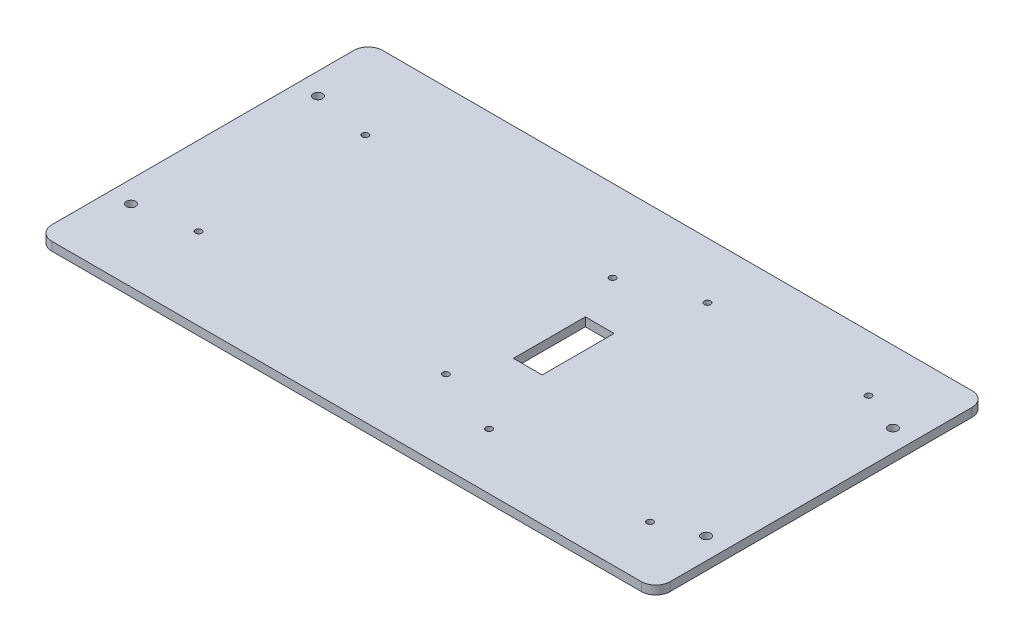
ISO-10303-21;
HEADER;
FILE_DESCRIPTION(('STEP AP214'),'2;1');
FILE_NAME('part.step','',(''),(''),'','','');
FILE_SCHEMA(('AUTOMOTIVE_DESIGN { 1 0 10303 214 1 1 1 1 }'));
ENDSEC;
DATA;
#1=APPLICATION_CONTEXT('core data for automotive mechanical design processes');
#2=APPLICATION_PROTOCOL_DEFINITION('international standard','automotive_design',2000,#1);
#3=PRODUCT_CONTEXT('',#1,'mechanical');
#4=PRODUCT('Part','Part','',(#3));
#5=PRODUCT_RELATED_PRODUCT_CATEGORY('part','',(#4));
#6=PRODUCT_DEFINITION_FORMATION('','',#4);
#7=PRODUCT_DEFINITION_CONTEXT('part definition',#1,'design');
#8=PRODUCT_DEFINITION('design','',#6,#7);
#9=PRODUCT_DEFINITION_SHAPE('','',#8);
#10=(LENGTH_UNIT() NAMED_UNIT(*) SI_UNIT(.MILLI.,.METRE.));
#11=(NAMED_UNIT(*) PLANE_ANGLE_UNIT() SI_UNIT($,.RADIAN.));
#12=(NAMED_UNIT(*) SI_UNIT($,.STERADIAN.) SOLID_ANGLE_UNIT());
#13=UNCERTAINTY_MEASURE_WITH_UNIT(LENGTH_MEASURE(1.E-05),#10,'distance_accuracy_value','');
#14=(GEOMETRIC_REPRESENTATION_CONTEXT(3) GLOBAL_UNCERTAINTY_ASSIGNED_CONTEXT((#13)) GLOBAL_UNIT_ASSIGNED_CONTEXT((#10,
#11,#12)) REPRESENTATION_CONTEXT('',''));
#15=CARTESIAN_POINT('',(0.,0.,0.));
#16=DIRECTION('',(0.,0.,1.));
#17=DIRECTION('',(1.,0.,0.));
#18=AXIS2_PLACEMENT_3D('',#15,#16,#17);
#19=CARTESIAN_POINT('',(0.,3.,0.));
#20=DIRECTION('',(0.,-1.,0.));
#21=DIRECTION('',(0.,0.,-1.));
#22=AXIS2_PLACEMENT_3D('',#19,#20,#21);
#23=PLANE('',#22);
#24=CARTESIAN_POINT('',(30.,3.,38.));
#25=DIRECTION('',(0.,1.,0.));
#26=DIRECTION('',(0.,0.,-1.));
#27=AXIS2_PLACEMENT_3D('',#24,#25,#26);
#28=CIRCLE('',#27,1.09999999999999);
#29=CARTESIAN_POINT('',(30.,3.,36.9));
#30=VERTEX_POINT('',#29);
#31=EDGE_CURVE('E164',#30,#30,#28,.T.);
#32=ORIENTED_EDGE('',*,*,#31,.F.);
#33=EDGE_LOOP('',(#32));
#34=FACE_BOUND('',#33,.T.);
#35=CARTESIAN_POINT('',(86.,3.,38.));
#36=DIRECTION('',(0.,1.,0.));
#37=DIRECTION('',(0.,0.,-1.));
#38=AXIS2_PLACEMENT_3D('',#35,#36,#37);
#39=CIRCLE('',#38,1.10000000000001);
#40=CARTESIAN_POINT('',(86.,3.,36.9));
#41=VERTEX_POINT('',#40);
#42=EDGE_CURVE('E170',#41,#41,#39,.T.);
#43=ORIENTED_EDGE('',*,*,#42,.F.);
#44=EDGE_LOOP('',(#43));
#45=FACE_BOUND('',#44,.T.);
#46=CARTESIAN_POINT('',(86.,3.,-38.));
#47=DIRECTION('',(0.,1.,0.));
#48=DIRECTION('',(0.,0.,1.));
#49=AXIS2_PLACEMENT_3D('',#46,#47,#48);
#50=CIRCLE('',#49,1.10000000000001);
#51=CARTESIAN_POINT('',(86.,3.,-36.9));
#52=VERTEX_POINT('',#51);
#53=EDGE_CURVE('E176',#52,#52,#50,.T.);
#54=ORIENTED_EDGE('',*,*,#53,.F.);
#55=EDGE_LOOP('',(#54));
#56=FACE_BOUND('',#55,.T.);
#57=CARTESIAN_POINT('',(30.,3.,-38.));
#58=DIRECTION('',(0.,1.,0.));
#59=DIRECTION('',(0.,0.,1.));
#60=AXIS2_PLACEMENT_3D('',#57,#58,#59);
#61=CIRCLE('',#60,1.09999999999999);
#62=CARTESIAN_POINT('',(30.,3.,-36.9));
#63=VERTEX_POINT('',#62);
#64=EDGE_CURVE('E182',#63,#63,#61,.T.);
#65=ORIENTED_EDGE('',*,*,#64,.F.);
#66=EDGE_LOOP('',(#65));
#67=FACE_BOUND('',#66,.T.);
#68=CARTESIAN_POINT('',(-80.,3.,29.));
#69=DIRECTION('',(0.,1.,0.));
#70=DIRECTION('',(0.,0.,-1.));
#71=AXIS2_PLACEMENT_3D('',#68,#69,#70);
#72=CIRCLE('',#71,1.10000000000001);
#73=CARTESIAN_POINT('',(-80.,3.,27.9));
#74=VERTEX_POINT('',#73);
#75=EDGE_CURVE('E188',#74,#74,#72,.T.);
#76=ORIENTED_EDGE('',*,*,#75,.F.);
#77=EDGE_LOOP('',(#76));
#78=FACE_BOUND('',#77,.T.);
#79=CARTESIAN_POINT('',(6.,3.,29.0000000000001));
#80=DIRECTION('',(0.,1.,0.));
#81=DIRECTION('',(0.,0.,-1.));
#82=AXIS2_PLACEMENT_3D('',#79,#80,#81);
#83=CIRCLE('',#82,1.1);
#84=CARTESIAN_POINT('',(6.,3.,27.9000000000001));
#85=VERTEX_POINT('',#84);
#86=EDGE_CURVE('E194',#85,#85,#83,.T.);
#87=ORIENTED_EDGE('',*,*,#86,.F.);
#88=EDGE_LOOP('',(#87));
#89=FACE_BOUND('',#88,.T.);
#90=CARTESIAN_POINT('',(6.,3.,-29.));
#91=DIRECTION('',(0.,1.,0.));
#92=DIRECTION('',(0.,0.,1.));
#93=AXIS2_PLACEMENT_3D('',#90,#91,#92);
#94=CIRCLE('',#93,1.1);
#95=CARTESIAN_POINT('',(6.,3.,-27.9));
#96=VERTEX_POINT('',#95);
#97=EDGE_CURVE('E200',#96,#96,#94,.T.);
#98=ORIENTED_EDGE('',*,*,#97,.F.);
#99=EDGE_LOOP('',(#98));
#100=FACE_BOUND('',#99,.T.);
#101=CARTESIAN_POINT('',(-80.,3.,-29.));
#102=DIRECTION('',(0.,1.,0.));
#103=DIRECTION('',(0.,0.,1.));
#104=AXIS2_PLACEMENT_3D('',#101,#102,#103);
#105=CIRCLE('',#104,1.10000000000001);
#106=CARTESIAN_POINT('',(-80.,3.,-27.9));
#107=VERTEX_POINT('',#106);
#108=EDGE_CURVE('E206',#107,#107,#105,.T.);
#109=ORIENTED_EDGE('',*,*,#108,.F.);
#110=EDGE_LOOP('',(#109));
#111=FACE_BOUND('',#110,.T.);
#112=CARTESIAN_POINT('',(-100.,3.,-32.4999999999999));
#113=DIRECTION('',(0.,1.,0.));
#114=DIRECTION('',(0.,0.,1.));
#115=AXIS2_PLACEMENT_3D('',#112,#113,#114);
#116=CIRCLE('',#115,1.60000000000001);
#117=CARTESIAN_POINT('',(-100.,3.,-30.8999999999999));
#118=VERTEX_POINT('',#117);
#119=EDGE_CURVE('E212',#118,#118,#116,.T.);
#120=ORIENTED_EDGE('',*,*,#119,.F.);
#121=EDGE_LOOP('',(#120));
#122=FACE_BOUND('',#121,.T.);
#123=CARTESIAN_POINT('',(100.,3.,-32.5));
#124=DIRECTION('',(0.,1.,0.));
#125=DIRECTION('',(0.,0.,-1.));
#126=AXIS2_PLACEMENT_3D('',#123,#124,#125);
#127=CIRCLE('',#126,1.60000000000001);
#128=CARTESIAN_POINT('',(100.,3.,-34.1));
#129=VERTEX_POINT('',#128);
#130=EDGE_CURVE('E218',#129,#129,#127,.T.);
#131=ORIENTED_EDGE('',*,*,#130,.F.);
#132=EDGE_LOOP('',(#131));
#133=FACE_BOUND('',#132,.T.);
#134=CARTESIAN_POINT('',(-100.,3.,32.5));
#135=DIRECTION('',(0.,1.,0.));
#136=DIRECTION('',(0.,0.,-1.));
#137=AXIS2_PLACEMENT_3D('',#134,#135,#136);
#138=CIRCLE('',#137,1.60000000000001);
#139=CARTESIAN_POINT('',(-100.,3.,30.9));
#140=VERTEX_POINT('',#139);
#141=EDGE_CURVE('E224',#140,#140,#138,.T.);
#142=ORIENTED_EDGE('',*,*,#141,.F.);
#143=EDGE_LOOP('',(#142));
#144=FACE_BOUND('',#143,.T.);
#145=CARTESIAN_POINT('',(100.,3.,32.5));
#146=DIRECTION('',(0.,1.,0.));
#147=DIRECTION('',(0.,0.,1.));
#148=AXIS2_PLACEMENT_3D('',#145,#146,#147);
#149=CIRCLE('',#148,1.60000000000001);
#150=CARTESIAN_POINT('',(100.,3.,34.1));
#151=VERTEX_POINT('',#150);
#152=EDGE_CURVE('E230',#151,#151,#149,.T.);
#153=ORIENTED_EDGE('',*,*,#152,.F.);
#154=EDGE_LOOP('',(#153));
#155=FACE_BOUND('',#154,.T.);
#156=DIRECTION('',(-1.,0.,0.));
#157=VECTOR('',#156,1.);
#158=CARTESIAN_POINT('',(-107.5,3.,-57.5));
#159=LINE('',#158,#157);
#160=CARTESIAN_POINT('',(102.5,3.,-57.5));
#161=VERTEX_POINT('',#160);
#162=CARTESIAN_POINT('',(-102.5,3.,-57.5));
#163=VERTEX_POINT('',#162);
#164=EDGE_CURVE('E239',#161,#163,#159,.T.);
#165=ORIENTED_EDGE('',*,*,#164,.T.);
#166=CARTESIAN_POINT('',(-102.5,3.,-52.5));
#167=DIRECTION('',(0.,-1.,0.));
#168=DIRECTION('',(0.,0.,-1.));
#169=AXIS2_PLACEMENT_3D('',#166,#167,#168);
#170=CIRCLE('',#169,5.);
#171=CARTESIAN_POINT('',(-107.5,3.,-52.5));
#172=VERTEX_POINT('',#171);
#173=EDGE_CURVE('E279',#163,#172,#170,.F.);
#174=ORIENTED_EDGE('',*,*,#173,.T.);
#175=DIRECTION('',(0.,0.,1.));
#176=VECTOR('',#175,1.);
#177=CARTESIAN_POINT('',(-107.5,3.,57.5));
#178=LINE('',#177,#176);
#179=CARTESIAN_POINT('',(-107.5,3.,52.5));
#180=VERTEX_POINT('',#179);
#181=EDGE_CURVE('E243',#172,#180,#178,.T.);
#182=ORIENTED_EDGE('',*,*,#181,.T.);
#183=CARTESIAN_POINT('',(-102.5,3.,52.5));
#184=DIRECTION('',(0.,-1.,0.));
#185=DIRECTION('',(0.,0.,-1.));
#186=AXIS2_PLACEMENT_3D('',#183,#184,#185);
#187=CIRCLE('',#186,5.);
#188=CARTESIAN_POINT('',(-102.5,3.,57.5));
#189=VERTEX_POINT('',#188);
#190=EDGE_CURVE('E53',#180,#189,#187,.F.);
#191=ORIENTED_EDGE('',*,*,#190,.T.);
#192=DIRECTION('',(1.,0.,0.));
#193=VECTOR('',#192,1.);
#194=CARTESIAN_POINT('',(-107.5,3.,57.5));
#195=LINE('',#194,#193);
#196=CARTESIAN_POINT('',(102.5,3.,57.5));
#197=VERTEX_POINT('',#196);
#198=EDGE_CURVE('E245',#189,#197,#195,.T.);
#199=ORIENTED_EDGE('',*,*,#198,.T.);
#200=CARTESIAN_POINT('',(102.5,3.,52.5));
#201=DIRECTION('',(0.,-1.,0.));
#202=DIRECTION('',(0.,0.,-1.));
#203=AXIS2_PLACEMENT_3D('',#200,#201,#202);
#204=CIRCLE('',#203,5.);
#205=CARTESIAN_POINT('',(107.5,3.,52.5));
#206=VERTEX_POINT('',#205);
#207=EDGE_CURVE('E275',#197,#206,#204,.F.);
#208=ORIENTED_EDGE('',*,*,#207,.T.);
#209=DIRECTION('',(0.,0.,-1.));
#210=VECTOR('',#209,1.);
#211=CARTESIAN_POINT('',(107.5,3.,57.5));
#212=LINE('',#211,#210);
#213=CARTESIAN_POINT('',(107.5,3.,-52.5));
#214=VERTEX_POINT('',#213);
#215=EDGE_CURVE('E236',#206,#214,#212,.T.);
#216=ORIENTED_EDGE('',*,*,#215,.T.);
#217=CARTESIAN_POINT('',(102.5,3.,-52.5));
#218=DIRECTION('',(0.,-1.,0.));
#219=DIRECTION('',(0.,0.,-1.));
#220=AXIS2_PLACEMENT_3D('',#217,#218,#219);
#221=CIRCLE('',#220,5.);
#222=EDGE_CURVE('E277',#214,#161,#221,.F.);
#223=ORIENTED_EDGE('',*,*,#222,.T.);
#224=EDGE_LOOP('',(#165,#174,#182,#191,#199,#208,#216,#223));
#225=FACE_BOUND('',#224,.T.);
#226=DIRECTION('',(0.,0.,-1.));
#227=VECTOR('',#226,1.);
#228=CARTESIAN_POINT('',(23.,3.,12.5));
#229=LINE('',#228,#227);
#230=CARTESIAN_POINT('',(23.,3.,12.5));
#231=VERTEX_POINT('',#230);
#232=CARTESIAN_POINT('',(23.,3.,-12.5));
#233=VERTEX_POINT('',#232);
#234=EDGE_CURVE('E123',#231,#233,#229,.T.);
#235=ORIENTED_EDGE('',*,*,#234,.F.);
#236=DIRECTION('',(1.,0.,0.));
#237=VECTOR('',#236,1.);
#238=CARTESIAN_POINT('',(13.,3.,12.5));
#239=LINE('',#238,#237);
#240=CARTESIAN_POINT('',(13.,3.,12.5));
#241=VERTEX_POINT('',#240);
#242=EDGE_CURVE('E148',#241,#231,#239,.T.);
#243=ORIENTED_EDGE('',*,*,#242,.F.);
#244=DIRECTION('',(0.,0.,1.));
#245=VECTOR('',#244,1.);
#246=CARTESIAN_POINT('',(13.,3.,12.5));
#247=LINE('',#246,#245);
#248=CARTESIAN_POINT('',(13.,3.,-12.5));
#249=VERTEX_POINT('',#248);
#250=EDGE_CURVE('E146',#249,#241,#247,.T.);
#251=ORIENTED_EDGE('',*,*,#250,.F.);
#252=DIRECTION('',(-1.,0.,0.));
#253=VECTOR('',#252,1.);
#254=CARTESIAN_POINT('',(13.,3.,-12.5));
#255=LINE('',#254,#253);
#256=EDGE_CURVE('E133',#233,#249,#255,.T.);
#257=ORIENTED_EDGE('',*,*,#256,.F.);
#258=EDGE_LOOP('',(#235,#243,#251,#257));
#259=FACE_BOUND('',#258,.T.);
#260=ADVANCED_FACE('F33',(#34,#45,#56,#67,#78,#89,#100,#111,#122,#133,#144,#155,#225,#259),#23,.F.);
#261=CARTESIAN_POINT('',(0.,0.,0.));
#262=DIRECTION('',(0.,-1.,0.));
#263=DIRECTION('',(0.,0.,-1.));
#264=AXIS2_PLACEMENT_3D('',#261,#262,#263);
#265=PLANE('',#264);
#266=CARTESIAN_POINT('',(86.,0.,38.));
#267=DIRECTION('',(0.,1.,0.));
#268=DIRECTION('',(0.,0.,-1.));
#269=AXIS2_PLACEMENT_3D('',#266,#267,#268);
#270=CIRCLE('',#269,1.10000000000001);
#271=CARTESIAN_POINT('',(86.,0.,36.9));
#272=VERTEX_POINT('',#271);
#273=EDGE_CURVE('E167',#272,#272,#270,.T.);
#274=ORIENTED_EDGE('',*,*,#273,.T.);
#275=EDGE_LOOP('',(#274));
#276=FACE_BOUND('',#275,.T.);
#277=CARTESIAN_POINT('',(30.,0.,-38.));
#278=DIRECTION('',(0.,1.,0.));
#279=DIRECTION('',(0.,0.,1.));
#280=AXIS2_PLACEMENT_3D('',#277,#278,#279);
#281=CIRCLE('',#280,1.09999999999999);
#282=CARTESIAN_POINT('',(30.,0.,-36.9));
#283=VERTEX_POINT('',#282);
#284=EDGE_CURVE('E179',#283,#283,#281,.T.);
#285=ORIENTED_EDGE('',*,*,#284,.T.);
#286=EDGE_LOOP('',(#285));
#287=FACE_BOUND('',#286,.T.);
#288=CARTESIAN_POINT('',(6.,0.,29.0000000000001));
#289=DIRECTION('',(0.,1.,0.));
#290=DIRECTION('',(0.,0.,-1.));
#291=AXIS2_PLACEMENT_3D('',#288,#289,#290);
#292=CIRCLE('',#291,1.1);
#293=CARTESIAN_POINT('',(6.,0.,27.9000000000001));
#294=VERTEX_POINT('',#293);
#295=EDGE_CURVE('E191',#294,#294,#292,.T.);
#296=ORIENTED_EDGE('',*,*,#295,.T.);
#297=EDGE_LOOP('',(#296));
#298=FACE_BOUND('',#297,.T.);
#299=CARTESIAN_POINT('',(-80.,0.,-29.));
#300=DIRECTION('',(0.,1.,0.));
#301=DIRECTION('',(0.,0.,1.));
#302=AXIS2_PLACEMENT_3D('',#299,#300,#301);
#303=CIRCLE('',#302,1.10000000000001);
#304=CARTESIAN_POINT('',(-80.,0.,-27.9));
#305=VERTEX_POINT('',#304);
#306=EDGE_CURVE('E203',#305,#305,#303,.T.);
#307=ORIENTED_EDGE('',*,*,#306,.T.);
#308=EDGE_LOOP('',(#307));
#309=FACE_BOUND('',#308,.T.);
#310=CARTESIAN_POINT('',(100.,0.,-32.5));
#311=DIRECTION('',(0.,1.,0.));
#312=DIRECTION('',(0.,0.,-1.));
#313=AXIS2_PLACEMENT_3D('',#310,#311,#312);
#314=CIRCLE('',#313,1.60000000000001);
#315=CARTESIAN_POINT('',(100.,0.,-34.1));
#316=VERTEX_POINT('',#315);
#317=EDGE_CURVE('E215',#316,#316,#314,.T.);
#318=ORIENTED_EDGE('',*,*,#317,.T.);
#319=EDGE_LOOP('',(#318));
#320=FACE_BOUND('',#319,.T.);
#321=CARTESIAN_POINT('',(100.,0.,32.5));
#322=DIRECTION('',(0.,1.,0.));
#323=DIRECTION('',(0.,0.,1.));
#324=AXIS2_PLACEMENT_3D('',#321,#322,#323);
#325=CIRCLE('',#324,1.60000000000001);
#326=CARTESIAN_POINT('',(100.,0.,34.1));
#327=VERTEX_POINT('',#326);
#328=EDGE_CURVE('E227',#327,#327,#325,.T.);
#329=ORIENTED_EDGE('',*,*,#328,.T.);
#330=EDGE_LOOP('',(#329));
#331=FACE_BOUND('',#330,.T.);
#332=DIRECTION('',(0.,0.,1.));
#333=VECTOR('',#332,1.);
#334=CARTESIAN_POINT('',(-107.5,0.,57.5));
#335=LINE('',#334,#333);
#336=CARTESIAN_POINT('',(-107.5,0.,-52.5));
#337=VERTEX_POINT('',#336);
#338=CARTESIAN_POINT('',(-107.5,0.,52.5));
#339=VERTEX_POINT('',#338);
#340=EDGE_CURVE('E253',#337,#339,#335,.T.);
#341=ORIENTED_EDGE('',*,*,#340,.F.);
#342=CARTESIAN_POINT('',(-102.5,0.,-52.5));
#343=DIRECTION('',(0.,-1.,0.));
#344=DIRECTION('',(0.,0.,-1.));
#345=AXIS2_PLACEMENT_3D('',#342,#343,#344);
#346=CIRCLE('',#345,5.);
#347=CARTESIAN_POINT('',(-102.5,0.,-57.5));
#348=VERTEX_POINT('',#347);
#349=EDGE_CURVE('E267',#337,#348,#346,.T.);
#350=ORIENTED_EDGE('',*,*,#349,.T.);
#351=DIRECTION('',(-1.,0.,0.));
#352=VECTOR('',#351,1.);
#353=CARTESIAN_POINT('',(-107.5,0.,-57.5));
#354=LINE('',#353,#352);
#355=CARTESIAN_POINT('',(102.5,0.,-57.5));
#356=VERTEX_POINT('',#355);
#357=EDGE_CURVE('E250',#356,#348,#354,.T.);
#358=ORIENTED_EDGE('',*,*,#357,.F.);
#359=CARTESIAN_POINT('',(102.5,0.,-52.5));
#360=DIRECTION('',(0.,-1.,0.));
#361=DIRECTION('',(0.,0.,-1.));
#362=AXIS2_PLACEMENT_3D('',#359,#360,#361);
#363=CIRCLE('',#362,5.);
#364=CARTESIAN_POINT('',(107.5,0.,-52.5));
#365=VERTEX_POINT('',#364);
#366=EDGE_CURVE('E265',#356,#365,#363,.T.);
#367=ORIENTED_EDGE('',*,*,#366,.T.);
#368=DIRECTION('',(0.,0.,-1.));
#369=VECTOR('',#368,1.);
#370=CARTESIAN_POINT('',(107.5,0.,57.5));
#371=LINE('',#370,#369);
#372=CARTESIAN_POINT('',(107.5,0.,52.5));
#373=VERTEX_POINT('',#372);
#374=EDGE_CURVE('E233',#373,#365,#371,.T.);
#375=ORIENTED_EDGE('',*,*,#374,.F.);
#376=CARTESIAN_POINT('',(102.5,0.,52.5));
#377=DIRECTION('',(0.,-1.,0.));
#378=DIRECTION('',(0.,0.,-1.));
#379=AXIS2_PLACEMENT_3D('',#376,#377,#378);
#380=CIRCLE('',#379,5.);
#381=CARTESIAN_POINT('',(102.5,0.,57.5));
#382=VERTEX_POINT('',#381);
#383=EDGE_CURVE('E263',#373,#382,#380,.T.);
#384=ORIENTED_EDGE('',*,*,#383,.T.);
#385=DIRECTION('',(1.,0.,0.));
#386=VECTOR('',#385,1.);
#387=CARTESIAN_POINT('',(-107.5,0.,57.5));
#388=LINE('',#387,#386);
#389=CARTESIAN_POINT('',(-102.5,0.,57.5));
#390=VERTEX_POINT('',#389);
#391=EDGE_CURVE('E240',#390,#382,#388,.T.);
#392=ORIENTED_EDGE('',*,*,#391,.F.);
#393=CARTESIAN_POINT('',(-102.5,0.,52.5));
#394=DIRECTION('',(0.,-1.,0.));
#395=DIRECTION('',(0.,0.,-1.));
#396=AXIS2_PLACEMENT_3D('',#393,#394,#395);
#397=CIRCLE('',#396,5.);
#398=EDGE_CURVE('E261',#390,#339,#397,.T.);
#399=ORIENTED_EDGE('',*,*,#398,.T.);
#400=EDGE_LOOP('',(#341,#350,#358,#367,#375,#384,#392,#399));
#401=FACE_BOUND('',#400,.T.);
#402=CARTESIAN_POINT('',(-100.,0.,32.5));
#403=DIRECTION('',(0.,1.,0.));
#404=DIRECTION('',(0.,0.,-1.));
#405=AXIS2_PLACEMENT_3D('',#402,#403,#404);
#406=CIRCLE('',#405,1.60000000000001);
#407=CARTESIAN_POINT('',(-100.,0.,30.9));
#408=VERTEX_POINT('',#407);
#409=EDGE_CURVE('E221',#408,#408,#406,.T.);
#410=ORIENTED_EDGE('',*,*,#409,.T.);
#411=EDGE_LOOP('',(#410));
#412=FACE_BOUND('',#411,.T.);
#413=CARTESIAN_POINT('',(-100.,0.,-32.4999999999999));
#414=DIRECTION('',(0.,1.,0.));
#415=DIRECTION('',(0.,0.,1.));
#416=AXIS2_PLACEMENT_3D('',#413,#414,#415);
#417=CIRCLE('',#416,1.60000000000001);
#418=CARTESIAN_POINT('',(-100.,0.,-30.8999999999999));
#419=VERTEX_POINT('',#418);
#420=EDGE_CURVE('E209',#419,#419,#417,.T.);
#421=ORIENTED_EDGE('',*,*,#420,.T.);
#422=EDGE_LOOP('',(#421));
#423=FACE_BOUND('',#422,.T.);
#424=CARTESIAN_POINT('',(6.,0.,-29.));
#425=DIRECTION('',(0.,1.,0.));
#426=DIRECTION('',(0.,0.,1.));
#427=AXIS2_PLACEMENT_3D('',#424,#425,#426);
#428=CIRCLE('',#427,1.1);
#429=CARTESIAN_POINT('',(6.,0.,-27.9));
#430=VERTEX_POINT('',#429);
#431=EDGE_CURVE('E197',#430,#430,#428,.T.);
#432=ORIENTED_EDGE('',*,*,#431,.T.);
#433=EDGE_LOOP('',(#432));
#434=FACE_BOUND('',#433,.T.);
#435=CARTESIAN_POINT('',(-80.,0.,29.));
#436=DIRECTION('',(0.,1.,0.));
#437=DIRECTION('',(0.,0.,-1.));
#438=AXIS2_PLACEMENT_3D('',#435,#436,#437);
#439=CIRCLE('',#438,1.10000000000001);
#440=CARTESIAN_POINT('',(-80.,0.,27.9));
#441=VERTEX_POINT('',#440);
#442=EDGE_CURVE('E185',#441,#441,#439,.T.);
#443=ORIENTED_EDGE('',*,*,#442,.T.);
#444=EDGE_LOOP('',(#443));
#445=FACE_BOUND('',#444,.T.);
#446=CARTESIAN_POINT('',(86.,0.,-38.));
#447=DIRECTION('',(0.,1.,0.));
#448=DIRECTION('',(0.,0.,1.));
#449=AXIS2_PLACEMENT_3D('',#446,#447,#448);
#450=CIRCLE('',#449,1.10000000000001);
#451=CARTESIAN_POINT('',(86.,0.,-36.9));
#452=VERTEX_POINT('',#451);
#453=EDGE_CURVE('E173',#452,#452,#450,.T.);
#454=ORIENTED_EDGE('',*,*,#453,.T.);
#455=EDGE_LOOP('',(#454));
#456=FACE_BOUND('',#455,.T.);
#457=CARTESIAN_POINT('',(30.,0.,38.));
#458=DIRECTION('',(0.,1.,0.));
#459=DIRECTION('',(0.,0.,-1.));
#460=AXIS2_PLACEMENT_3D('',#457,#458,#459);
#461=CIRCLE('',#460,1.09999999999999);
#462=CARTESIAN_POINT('',(30.,0.,36.9));
#463=VERTEX_POINT('',#462);
#464=EDGE_CURVE('E141',#463,#463,#461,.T.);
#465=ORIENTED_EDGE('',*,*,#464,.T.);
#466=EDGE_LOOP('',(#465));
#467=FACE_BOUND('',#466,.T.);
#468=DIRECTION('',(1.,0.,0.));
#469=VECTOR('',#468,1.);
#470=CARTESIAN_POINT('',(13.,0.,12.5));
#471=LINE('',#470,#469);
#472=CARTESIAN_POINT('',(13.,0.,12.5));
#473=VERTEX_POINT('',#472);
#474=CARTESIAN_POINT('',(23.,0.,12.5));
#475=VERTEX_POINT('',#474);
#476=EDGE_CURVE('E134',#473,#475,#471,.T.);
#477=ORIENTED_EDGE('',*,*,#476,.T.);
#478=DIRECTION('',(0.,0.,-1.));
#479=VECTOR('',#478,1.);
#480=CARTESIAN_POINT('',(23.,0.,12.5));
#481=LINE('',#480,#479);
#482=CARTESIAN_POINT('',(23.,0.,-12.5));
#483=VERTEX_POINT('',#482);
#484=EDGE_CURVE('E152',#475,#483,#481,.T.);
#485=ORIENTED_EDGE('',*,*,#484,.T.);
#486=DIRECTION('',(-1.,0.,0.));
#487=VECTOR('',#486,1.);
#488=CARTESIAN_POINT('',(13.,0.,-12.5));
#489=LINE('',#488,#487);
#490=CARTESIAN_POINT('',(13.,0.,-12.5));
#491=VERTEX_POINT('',#490);
#492=EDGE_CURVE('E140',#483,#491,#489,.T.);
#493=ORIENTED_EDGE('',*,*,#492,.T.);
#494=DIRECTION('',(0.,0.,1.));
#495=VECTOR('',#494,1.);
#496=CARTESIAN_POINT('',(13.,0.,12.5));
#497=LINE('',#496,#495);
#498=EDGE_CURVE('E155',#491,#473,#497,.T.);
#499=ORIENTED_EDGE('',*,*,#498,.T.);
#500=EDGE_LOOP('',(#477,#485,#493,#499));
#501=FACE_BOUND('',#500,.T.);
#502=ADVANCED_FACE('F292',(#276,#287,#298,#309,#320,#331,#401,#412,#423,#434,#445,#456,#467,
#501),#265,.T.);
#503=CARTESIAN_POINT('',(107.5,3.,57.5));
#504=DIRECTION('',(-1.,0.,0.));
#505=DIRECTION('',(0.,0.,1.));
#506=AXIS2_PLACEMENT_3D('',#503,#504,#505);
#507=PLANE('',#506);
#508=ORIENTED_EDGE('',*,*,#374,.T.);
#509=DIRECTION('',(0.,-1.,0.));
#510=VECTOR('',#509,1.);
#511=CARTESIAN_POINT('',(107.5,3.,-52.5));
#512=LINE('',#511,#510);
#513=EDGE_CURVE('E284',#365,#214,#512,.F.);
#514=ORIENTED_EDGE('',*,*,#513,.T.);
#515=ORIENTED_EDGE('',*,*,#215,.F.);
#516=DIRECTION('',(0.,-1.,0.));
#517=VECTOR('',#516,1.);
#518=CARTESIAN_POINT('',(107.5,3.,52.5));
#519=LINE('',#518,#517);
#520=EDGE_CURVE('E281',#206,#373,#519,.T.);
#521=ORIENTED_EDGE('',*,*,#520,.T.);
#522=EDGE_LOOP('',(#508,#514,#515,#521));
#523=FACE_BOUND('',#522,.T.);
#524=ADVANCED_FACE('F301',(#523),#507,.F.);
#525=CARTESIAN_POINT('',(-107.5,3.,-57.5));
#526=DIRECTION('',(0.,0.,1.));
#527=DIRECTION('',(1.,0.,0.));
#528=AXIS2_PLACEMENT_3D('',#525,#526,#527);
#529=PLANE('',#528);
#530=ORIENTED_EDGE('',*,*,#357,.T.);
#531=DIRECTION('',(0.,-1.,0.));
#532=VECTOR('',#531,1.);
#533=CARTESIAN_POINT('',(-102.5,3.,-57.5));
#534=LINE('',#533,#532);
#535=EDGE_CURVE('E272',#348,#163,#534,.F.);
#536=ORIENTED_EDGE('',*,*,#535,.T.);
#537=ORIENTED_EDGE('',*,*,#164,.F.);
#538=DIRECTION('',(0.,-1.,0.));
#539=VECTOR('',#538,1.);
#540=CARTESIAN_POINT('',(102.5,3.,-57.5));
#541=LINE('',#540,#539);
#542=EDGE_CURVE('E269',#161,#356,#541,.T.);
#543=ORIENTED_EDGE('',*,*,#542,.T.);
#544=EDGE_LOOP('',(#530,#536,#537,#543));
#545=FACE_BOUND('',#544,.T.);
#546=ADVANCED_FACE('F310',(#545),#529,.F.);
#547=CARTESIAN_POINT('',(-107.5,3.,57.5));
#548=DIRECTION('',(1.,0.,0.));
#549=DIRECTION('',(0.,0.,-1.));
#550=AXIS2_PLACEMENT_3D('',#547,#548,#549);
#551=PLANE('',#550);
#552=ORIENTED_EDGE('',*,*,#181,.F.);
#553=DIRECTION('',(0.,-1.,0.));
#554=VECTOR('',#553,1.);
#555=CARTESIAN_POINT('',(-107.5,3.,-52.5));
#556=LINE('',#555,#554);
#557=EDGE_CURVE('E258',#172,#337,#556,.T.);
#558=ORIENTED_EDGE('',*,*,#557,.T.);
#559=ORIENTED_EDGE('',*,*,#340,.T.);
#560=DIRECTION('',(0.,-1.,0.));
#561=VECTOR('',#560,1.);
#562=CARTESIAN_POINT('',(-107.5,3.,52.5));
#563=LINE('',#562,#561);
#564=EDGE_CURVE('E247',#339,#180,#563,.F.);
#565=ORIENTED_EDGE('',*,*,#564,.T.);
#566=EDGE_LOOP('',(#552,#558,#559,#565));
#567=FACE_BOUND('',#566,.T.);
#568=ADVANCED_FACE('F318',(#567),#551,.F.);
#569=CARTESIAN_POINT('',(-107.5,3.,57.5));
#570=DIRECTION('',(0.,0.,-1.));
#571=DIRECTION('',(-1.,0.,0.));
#572=AXIS2_PLACEMENT_3D('',#569,#570,#571);
#573=PLANE('',#572);
#574=ORIENTED_EDGE('',*,*,#391,.T.);
#575=DIRECTION('',(0.,-1.,0.));
#576=VECTOR('',#575,1.);
#577=CARTESIAN_POINT('',(102.5,3.,57.5));
#578=LINE('',#577,#576);
#579=EDGE_CURVE('E11',#382,#197,#578,.F.);
#580=ORIENTED_EDGE('',*,*,#579,.T.);
#581=ORIENTED_EDGE('',*,*,#198,.F.);
#582=DIRECTION('',(0.,-1.,0.));
#583=VECTOR('',#582,1.);
#584=CARTESIAN_POINT('',(-102.5,3.,57.5));
#585=LINE('',#584,#583);
#586=EDGE_CURVE('E41',#189,#390,#585,.T.);
#587=ORIENTED_EDGE('',*,*,#586,.T.);
#588=EDGE_LOOP('',(#574,#580,#581,#587));
#589=FACE_BOUND('',#588,.T.);
#590=ADVANCED_FACE('F288',(#589),#573,.F.);
#591=CARTESIAN_POINT('',(100.,3.,32.5));
#592=DIRECTION('',(0.,-1.,0.));
#593=DIRECTION('',(0.,0.,-1.));
#594=AXIS2_PLACEMENT_3D('',#591,#592,#593);
#595=CYLINDRICAL_SURFACE('',#594,1.60000000000001);
#596=ORIENTED_EDGE('',*,*,#152,.T.);
#597=EDGE_LOOP('',(#596));
#598=FACE_BOUND('',#597,.T.);
#599=ORIENTED_EDGE('',*,*,#328,.F.);
#600=EDGE_LOOP('',(#599));
#601=FACE_BOUND('',#600,.T.);
#602=ADVANCED_FACE('F335',(#598,#601),#595,.F.);
#603=CARTESIAN_POINT('',(-100.,3.,32.5));
#604=DIRECTION('',(0.,-1.,0.));
#605=DIRECTION('',(0.,0.,-1.));
#606=AXIS2_PLACEMENT_3D('',#603,#604,#605);
#607=CYLINDRICAL_SURFACE('',#606,1.60000000000001);
#608=ORIENTED_EDGE('',*,*,#141,.T.);
#609=EDGE_LOOP('',(#608));
#610=FACE_BOUND('',#609,.T.);
#611=ORIENTED_EDGE('',*,*,#409,.F.);
#612=EDGE_LOOP('',(#611));
#613=FACE_BOUND('',#612,.T.);
#614=ADVANCED_FACE('F492',(#610,#613),#607,.F.);
#615=CARTESIAN_POINT('',(100.,3.,-32.5));
#616=DIRECTION('',(0.,-1.,0.));
#617=DIRECTION('',(0.,0.,-1.));
#618=AXIS2_PLACEMENT_3D('',#615,#616,#617);
#619=CYLINDRICAL_SURFACE('',#618,1.60000000000001);
#620=ORIENTED_EDGE('',*,*,#130,.T.);
#621=EDGE_LOOP('',(#620));
#622=FACE_BOUND('',#621,.T.);
#623=ORIENTED_EDGE('',*,*,#317,.F.);
#624=EDGE_LOOP('',(#623));
#625=FACE_BOUND('',#624,.T.);
#626=ADVANCED_FACE('F483',(#622,#625),#619,.F.);
#627=CARTESIAN_POINT('',(-100.,3.,-32.4999999999999));
#628=DIRECTION('',(0.,-1.,0.));
#629=DIRECTION('',(0.,0.,-1.));
#630=AXIS2_PLACEMENT_3D('',#627,#628,#629);
#631=CYLINDRICAL_SURFACE('',#630,1.60000000000001);
#632=ORIENTED_EDGE('',*,*,#119,.T.);
#633=EDGE_LOOP('',(#632));
#634=FACE_BOUND('',#633,.T.);
#635=ORIENTED_EDGE('',*,*,#420,.F.);
#636=EDGE_LOOP('',(#635));
#637=FACE_BOUND('',#636,.T.);
#638=ADVANCED_FACE('F474',(#634,#637),#631,.F.);
#639=CARTESIAN_POINT('',(-80.,3.,-29.));
#640=DIRECTION('',(0.,-1.,0.));
#641=DIRECTION('',(0.,0.,-1.));
#642=AXIS2_PLACEMENT_3D('',#639,#640,#641);
#643=CYLINDRICAL_SURFACE('',#642,1.10000000000001);
#644=ORIENTED_EDGE('',*,*,#108,.T.);
#645=EDGE_LOOP('',(#644));
#646=FACE_BOUND('',#645,.T.);
#647=ORIENTED_EDGE('',*,*,#306,.F.);
#648=EDGE_LOOP('',(#647));
#649=FACE_BOUND('',#648,.T.);
#650=ADVANCED_FACE('F465',(#646,#649),#643,.F.);
#651=CARTESIAN_POINT('',(6.,3.,-29.));
#652=DIRECTION('',(0.,-1.,0.));
#653=DIRECTION('',(0.,0.,-1.));
#654=AXIS2_PLACEMENT_3D('',#651,#652,#653);
#655=CYLINDRICAL_SURFACE('',#654,1.1);
#656=ORIENTED_EDGE('',*,*,#97,.T.);
#657=EDGE_LOOP('',(#656));
#658=FACE_BOUND('',#657,.T.);
#659=ORIENTED_EDGE('',*,*,#431,.F.);
#660=EDGE_LOOP('',(#659));
#661=FACE_BOUND('',#660,.T.);
#662=ADVANCED_FACE('F456',(#658,#661),#655,.F.);
#663=CARTESIAN_POINT('',(6.,3.,29.0000000000001));
#664=DIRECTION('',(0.,-1.,0.));
#665=DIRECTION('',(0.,0.,-1.));
#666=AXIS2_PLACEMENT_3D('',#663,#664,#665);
#667=CYLINDRICAL_SURFACE('',#666,1.1);
#668=ORIENTED_EDGE('',*,*,#86,.T.);
#669=EDGE_LOOP('',(#668));
#670=FACE_BOUND('',#669,.T.);
#671=ORIENTED_EDGE('',*,*,#295,.F.);
#672=EDGE_LOOP('',(#671));
#673=FACE_BOUND('',#672,.T.);
#674=ADVANCED_FACE('F447',(#670,#673),#667,.F.);
#675=CARTESIAN_POINT('',(-80.,3.,29.));
#676=DIRECTION('',(0.,-1.,0.));
#677=DIRECTION('',(0.,0.,-1.));
#678=AXIS2_PLACEMENT_3D('',#675,#676,#677);
#679=CYLINDRICAL_SURFACE('',#678,1.10000000000001);
#680=ORIENTED_EDGE('',*,*,#75,.T.);
#681=EDGE_LOOP('',(#680));
#682=FACE_BOUND('',#681,.T.);
#683=ORIENTED_EDGE('',*,*,#442,.F.);
#684=EDGE_LOOP('',(#683));
#685=FACE_BOUND('',#684,.T.);
#686=ADVANCED_FACE('F438',(#682,#685),#679,.F.);
#687=CARTESIAN_POINT('',(30.,3.,-38.));
#688=DIRECTION('',(0.,-1.,0.));
#689=DIRECTION('',(0.,0.,-1.));
#690=AXIS2_PLACEMENT_3D('',#687,#688,#689);
#691=CYLINDRICAL_SURFACE('',#690,1.09999999999999);
#692=ORIENTED_EDGE('',*,*,#64,.T.);
#693=EDGE_LOOP('',(#692));
#694=FACE_BOUND('',#693,.T.);
#695=ORIENTED_EDGE('',*,*,#284,.F.);
#696=EDGE_LOOP('',(#695));
#697=FACE_BOUND('',#696,.T.);
#698=ADVANCED_FACE('F429',(#694,#697),#691,.F.);
#699=CARTESIAN_POINT('',(86.,3.,-38.));
#700=DIRECTION('',(0.,-1.,0.));
#701=DIRECTION('',(0.,0.,-1.));
#702=AXIS2_PLACEMENT_3D('',#699,#700,#701);
#703=CYLINDRICAL_SURFACE('',#702,1.10000000000001);
#704=ORIENTED_EDGE('',*,*,#53,.T.);
#705=EDGE_LOOP('',(#704));
#706=FACE_BOUND('',#705,.T.);
#707=ORIENTED_EDGE('',*,*,#453,.F.);
#708=EDGE_LOOP('',(#707));
#709=FACE_BOUND('',#708,.T.);
#710=ADVANCED_FACE('F420',(#706,#709),#703,.F.);
#711=CARTESIAN_POINT('',(86.,3.,38.));
#712=DIRECTION('',(0.,-1.,0.));
#713=DIRECTION('',(0.,0.,-1.));
#714=AXIS2_PLACEMENT_3D('',#711,#712,#713);
#715=CYLINDRICAL_SURFACE('',#714,1.10000000000001);
#716=ORIENTED_EDGE('',*,*,#42,.T.);
#717=EDGE_LOOP('',(#716));
#718=FACE_BOUND('',#717,.T.);
#719=ORIENTED_EDGE('',*,*,#273,.F.);
#720=EDGE_LOOP('',(#719));
#721=FACE_BOUND('',#720,.T.);
#722=ADVANCED_FACE('F411',(#718,#721),#715,.F.);
#723=CARTESIAN_POINT('',(30.,3.,38.));
#724=DIRECTION('',(0.,-1.,0.));
#725=DIRECTION('',(0.,0.,-1.));
#726=AXIS2_PLACEMENT_3D('',#723,#724,#725);
#727=CYLINDRICAL_SURFACE('',#726,1.09999999999999);
#728=ORIENTED_EDGE('',*,*,#31,.T.);
#729=EDGE_LOOP('',(#728));
#730=FACE_BOUND('',#729,.T.);
#731=ORIENTED_EDGE('',*,*,#464,.F.);
#732=EDGE_LOOP('',(#731));
#733=FACE_BOUND('',#732,.T.);
#734=ADVANCED_FACE('F403',(#730,#733),#727,.F.);
#735=CARTESIAN_POINT('',(23.,3.,12.5));
#736=DIRECTION('',(-1.,0.,0.));
#737=DIRECTION('',(0.,0.,1.));
#738=AXIS2_PLACEMENT_3D('',#735,#736,#737);
#739=PLANE('',#738);
#740=ORIENTED_EDGE('',*,*,#484,.F.);
#741=DIRECTION('',(0.,-1.,0.));
#742=VECTOR('',#741,1.);
#743=CARTESIAN_POINT('',(23.,3.,12.5));
#744=LINE('',#743,#742);
#745=EDGE_CURVE('E129',#231,#475,#744,.T.);
#746=ORIENTED_EDGE('',*,*,#745,.F.);
#747=ORIENTED_EDGE('',*,*,#234,.T.);
#748=DIRECTION('',(0.,-1.,0.));
#749=VECTOR('',#748,1.);
#750=CARTESIAN_POINT('',(23.,3.,-12.5));
#751=LINE('',#750,#749);
#752=EDGE_CURVE('E126',#233,#483,#751,.T.);
#753=ORIENTED_EDGE('',*,*,#752,.T.);
#754=EDGE_LOOP('',(#740,#746,#747,#753));
#755=FACE_BOUND('',#754,.T.);
#756=ADVANCED_FACE('F125',(#755),#739,.T.);
#757=CARTESIAN_POINT('',(13.,3.,-12.5));
#758=DIRECTION('',(0.,0.,1.));
#759=DIRECTION('',(1.,0.,0.));
#760=AXIS2_PLACEMENT_3D('',#757,#758,#759);
#761=PLANE('',#760);
#762=ORIENTED_EDGE('',*,*,#492,.F.);
#763=ORIENTED_EDGE('',*,*,#752,.F.);
#764=ORIENTED_EDGE('',*,*,#256,.T.);
#765=DIRECTION('',(0.,-1.,0.));
#766=VECTOR('',#765,1.);
#767=CARTESIAN_POINT('',(13.,3.,-12.5));
#768=LINE('',#767,#766);
#769=EDGE_CURVE('E142',#249,#491,#768,.T.);
#770=ORIENTED_EDGE('',*,*,#769,.T.);
#771=EDGE_LOOP('',(#762,#763,#764,#770));
#772=FACE_BOUND('',#771,.T.);
#773=ADVANCED_FACE('F137',(#772),#761,.T.);
#774=CARTESIAN_POINT('',(13.,3.,12.5));
#775=DIRECTION('',(1.,0.,0.));
#776=DIRECTION('',(0.,0.,-1.));
#777=AXIS2_PLACEMENT_3D('',#774,#775,#776);
#778=PLANE('',#777);
#779=ORIENTED_EDGE('',*,*,#498,.F.);
#780=ORIENTED_EDGE('',*,*,#769,.F.);
#781=ORIENTED_EDGE('',*,*,#250,.T.);
#782=DIRECTION('',(0.,-1.,0.));
#783=VECTOR('',#782,1.);
#784=CARTESIAN_POINT('',(13.,3.,12.5));
#785=LINE('',#784,#783);
#786=EDGE_CURVE('E161',#241,#473,#785,.T.);
#787=ORIENTED_EDGE('',*,*,#786,.T.);
#788=EDGE_LOOP('',(#779,#780,#781,#787));
#789=FACE_BOUND('',#788,.T.);
#790=ADVANCED_FACE('F379',(#789),#778,.T.);
#791=CARTESIAN_POINT('',(13.,3.,12.5));
#792=DIRECTION('',(0.,0.,-1.));
#793=DIRECTION('',(-1.,0.,0.));
#794=AXIS2_PLACEMENT_3D('',#791,#792,#793);
#795=PLANE('',#794);
#796=ORIENTED_EDGE('',*,*,#476,.F.);
#797=ORIENTED_EDGE('',*,*,#786,.F.);
#798=ORIENTED_EDGE('',*,*,#242,.T.);
#799=ORIENTED_EDGE('',*,*,#745,.T.);
#800=EDGE_LOOP('',(#796,#797,#798,#799));
#801=FACE_BOUND('',#800,.T.);
#802=ADVANCED_FACE('F348',(#801),#795,.T.);
#803=CARTESIAN_POINT('',(-102.5,3.,-52.5));
#804=DIRECTION('',(0.,-1.,0.));
#805=DIRECTION('',(0.,0.,-1.));
#806=AXIS2_PLACEMENT_3D('',#803,#804,#805);
#807=CYLINDRICAL_SURFACE('',#806,5.);
#808=ORIENTED_EDGE('',*,*,#173,.F.);
#809=ORIENTED_EDGE('',*,*,#535,.F.);
#810=ORIENTED_EDGE('',*,*,#349,.F.);
#811=ORIENTED_EDGE('',*,*,#557,.F.);
#812=EDGE_LOOP('',(#808,#809,#810,#811));
#813=FACE_BOUND('',#812,.T.);
#814=ADVANCED_FACE('F315',(#813),#807,.T.);
#815=CARTESIAN_POINT('',(102.5,3.,-52.5));
#816=DIRECTION('',(0.,-1.,0.));
#817=DIRECTION('',(0.,0.,-1.));
#818=AXIS2_PLACEMENT_3D('',#815,#816,#817);
#819=CYLINDRICAL_SURFACE('',#818,5.);
#820=ORIENTED_EDGE('',*,*,#222,.F.);
#821=ORIENTED_EDGE('',*,*,#513,.F.);
#822=ORIENTED_EDGE('',*,*,#366,.F.);
#823=ORIENTED_EDGE('',*,*,#542,.F.);
#824=EDGE_LOOP('',(#820,#821,#822,#823));
#825=FACE_BOUND('',#824,.T.);
#826=ADVANCED_FACE('F307',(#825),#819,.T.);
#827=CARTESIAN_POINT('',(102.5,3.,52.5));
#828=DIRECTION('',(0.,-1.,0.));
#829=DIRECTION('',(0.,0.,-1.));
#830=AXIS2_PLACEMENT_3D('',#827,#828,#829);
#831=CYLINDRICAL_SURFACE('',#830,5.);
#832=ORIENTED_EDGE('',*,*,#207,.F.);
#833=ORIENTED_EDGE('',*,*,#579,.F.);
#834=ORIENTED_EDGE('',*,*,#383,.F.);
#835=ORIENTED_EDGE('',*,*,#520,.F.);
#836=EDGE_LOOP('',(#832,#833,#834,#835));
#837=FACE_BOUND('',#836,.T.);
#838=ADVANCED_FACE('F298',(#837),#831,.T.);
#839=CARTESIAN_POINT('',(-102.5,3.,52.5));
#840=DIRECTION('',(0.,-1.,0.));
#841=DIRECTION('',(0.,0.,-1.));
#842=AXIS2_PLACEMENT_3D('',#839,#840,#841);
#843=CYLINDRICAL_SURFACE('',#842,5.);
#844=ORIENTED_EDGE('',*,*,#190,.F.);
#845=ORIENTED_EDGE('',*,*,#564,.F.);
#846=ORIENTED_EDGE('',*,*,#398,.F.);
#847=ORIENTED_EDGE('',*,*,#586,.F.);
#848=EDGE_LOOP('',(#844,#845,#846,#847));
#849=FACE_BOUND('',#848,.T.);
#850=ADVANCED_FACE('F35',(#849),#843,.T.);
#851=CLOSED_SHELL('',(#260,#502,#524,#546,#568,#590,#602,#614,#626,#638,#650,#662,#674,#686,
#698,#710,#722,#734,#756,#773,#790,#802,#814,#826,#838,#850));
#852=MANIFOLD_SOLID_BREP('B2',#851);
#853=ADVANCED_BREP_SHAPE_REPRESENTATION('',(#18,#852),#14);
#854=SHAPE_DEFINITION_REPRESENTATION(#9,#853);
ENDSEC;
END-ISO-10303-21;
